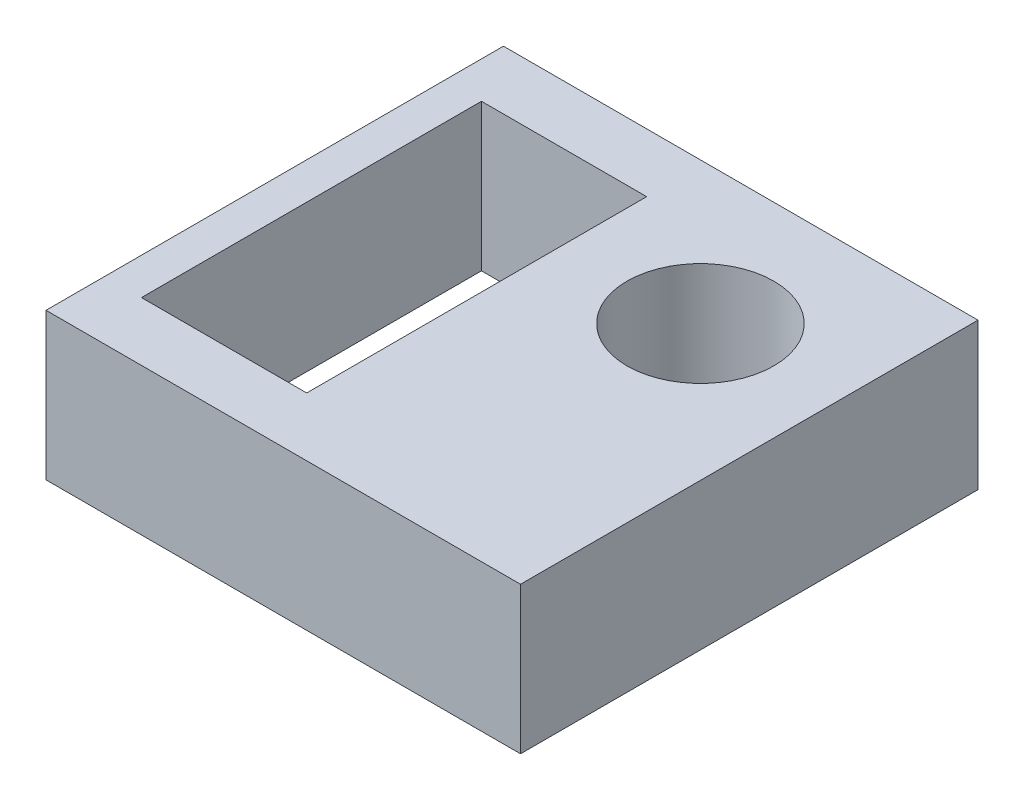
ISO-10303-21;
HEADER;
FILE_DESCRIPTION(('STEP AP214'),'2;1');
FILE_NAME('part.step','',(''),(''),'','','');
FILE_SCHEMA(('AUTOMOTIVE_DESIGN { 1 0 10303 214 1 1 1 1 }'));
ENDSEC;
DATA;
#1=APPLICATION_CONTEXT('core data for automotive mechanical design processes');
#2=APPLICATION_PROTOCOL_DEFINITION('international standard','automotive_design',2000,#1);
#3=PRODUCT_CONTEXT('',#1,'mechanical');
#4=PRODUCT('Part','Part','',(#3));
#5=PRODUCT_RELATED_PRODUCT_CATEGORY('part','',(#4));
#6=PRODUCT_DEFINITION_FORMATION('','',#4);
#7=PRODUCT_DEFINITION_CONTEXT('part definition',#1,'design');
#8=PRODUCT_DEFINITION('design','',#6,#7);
#9=PRODUCT_DEFINITION_SHAPE('','',#8);
#10=(LENGTH_UNIT() NAMED_UNIT(*) SI_UNIT(.MILLI.,.METRE.));
#11=(NAMED_UNIT(*) PLANE_ANGLE_UNIT() SI_UNIT($,.RADIAN.));
#12=(NAMED_UNIT(*) SI_UNIT($,.STERADIAN.) SOLID_ANGLE_UNIT());
#13=UNCERTAINTY_MEASURE_WITH_UNIT(LENGTH_MEASURE(1.E-05),#10,'distance_accuracy_value','');
#14=(GEOMETRIC_REPRESENTATION_CONTEXT(3) GLOBAL_UNCERTAINTY_ASSIGNED_CONTEXT((#13)) GLOBAL_UNIT_ASSIGNED_CONTEXT((#10,
#11,#12)) REPRESENTATION_CONTEXT('',''));
#15=CARTESIAN_POINT('',(0.,0.,0.));
#16=DIRECTION('',(0.,0.,1.));
#17=DIRECTION('',(1.,0.,0.));
#18=AXIS2_PLACEMENT_3D('',#15,#16,#17);
#19=CARTESIAN_POINT('',(0.,25.4,0.));
#20=DIRECTION('',(0.,1.,0.));
#21=DIRECTION('',(0.,0.,1.));
#22=AXIS2_PLACEMENT_3D('',#19,#20,#21);
#23=PLANE('',#22);
#24=DIRECTION('',(1.,0.,0.));
#25=VECTOR('',#24,1.);
#26=CARTESIAN_POINT('',(-75.7174,25.4,-10.16));
#27=LINE('',#26,#25);
#28=CARTESIAN_POINT('',(-75.7174,25.4,-10.16));
#29=VERTEX_POINT('',#28);
#30=CARTESIAN_POINT('',(-47.1424,25.4,-10.16));
#31=VERTEX_POINT('',#30);
#32=EDGE_CURVE('E106',#29,#31,#27,.T.);
#33=ORIENTED_EDGE('',*,*,#32,.F.);
#34=DIRECTION('',(0.,0.,1.));
#35=VECTOR('',#34,1.);
#36=CARTESIAN_POINT('',(-75.7174,25.4,-68.961));
#37=LINE('',#36,#35);
#38=CARTESIAN_POINT('',(-75.7174,25.4,-68.961));
#39=VERTEX_POINT('',#38);
#40=EDGE_CURVE('E98',#39,#29,#37,.T.);
#41=ORIENTED_EDGE('',*,*,#40,.F.);
#42=DIRECTION('',(-1.,0.,0.));
#43=VECTOR('',#42,1.);
#44=CARTESIAN_POINT('',(-75.7174,25.4,-68.961));
#45=LINE('',#44,#43);
#46=CARTESIAN_POINT('',(-47.1424,25.4,-68.961));
#47=VERTEX_POINT('',#46);
#48=EDGE_CURVE('E121',#47,#39,#45,.T.);
#49=ORIENTED_EDGE('',*,*,#48,.F.);
#50=DIRECTION('',(0.,0.,-1.));
#51=VECTOR('',#50,1.);
#52=CARTESIAN_POINT('',(-47.1424,25.4,-68.961));
#53=LINE('',#52,#51);
#54=EDGE_CURVE('E119',#31,#47,#53,.T.);
#55=ORIENTED_EDGE('',*,*,#54,.F.);
#56=EDGE_LOOP('',(#33,#41,#49,#55));
#57=FACE_BOUND('',#56,.T.);
#58=DIRECTION('',(0.,0.,-1.));
#59=VECTOR('',#58,1.);
#60=CARTESIAN_POINT('',(0.,25.4,0.));
#61=LINE('',#60,#59);
#62=CARTESIAN_POINT('',(0.,25.4,0.));
#63=VERTEX_POINT('',#62);
#64=CARTESIAN_POINT('',(0.,25.4,-79.121));
#65=VERTEX_POINT('',#64);
#66=EDGE_CURVE('E137',#63,#65,#61,.T.);
#67=ORIENTED_EDGE('',*,*,#66,.T.);
#68=DIRECTION('',(-1.,0.,0.));
#69=VECTOR('',#68,1.);
#70=CARTESIAN_POINT('',(0.,25.4,-79.121));
#71=LINE('',#70,#69);
#72=CARTESIAN_POINT('',(-82.0674,25.4,-79.121));
#73=VERTEX_POINT('',#72);
#74=EDGE_CURVE('E140',#65,#73,#71,.T.);
#75=ORIENTED_EDGE('',*,*,#74,.T.);
#76=DIRECTION('',(0.,0.,1.));
#77=VECTOR('',#76,1.);
#78=CARTESIAN_POINT('',(-82.0674,25.4,0.));
#79=LINE('',#78,#77);
#80=CARTESIAN_POINT('',(-82.0674,25.4,0.));
#81=VERTEX_POINT('',#80);
#82=EDGE_CURVE('E143',#73,#81,#79,.T.);
#83=ORIENTED_EDGE('',*,*,#82,.T.);
#84=DIRECTION('',(1.,0.,0.));
#85=VECTOR('',#84,1.);
#86=CARTESIAN_POINT('',(0.,25.4,0.));
#87=LINE('',#86,#85);
#88=EDGE_CURVE('E145',#81,#63,#87,.T.);
#89=ORIENTED_EDGE('',*,*,#88,.T.);
#90=EDGE_LOOP('',(#67,#75,#83,#89));
#91=FACE_BOUND('',#90,.T.);
#92=CARTESIAN_POINT('',(-23.495,25.4,-54.61));
#93=DIRECTION('',(0.,1.,0.));
#94=DIRECTION('',(0.,0.,1.));
#95=AXIS2_PLACEMENT_3D('',#92,#93,#94);
#96=CIRCLE('',#95,12.7);
#97=CARTESIAN_POINT('',(-23.495,25.4,-41.91));
#98=VERTEX_POINT('',#97);
#99=EDGE_CURVE('E127',#98,#98,#96,.T.);
#100=ORIENTED_EDGE('',*,*,#99,.F.);
#101=EDGE_LOOP('',(#100));
#102=FACE_BOUND('',#101,.T.);
#103=ADVANCED_FACE('F33',(#57,#91,#102),#23,.T.);
#104=CARTESIAN_POINT('',(0.,0.,0.));
#105=DIRECTION('',(0.,1.,0.));
#106=DIRECTION('',(0.,0.,1.));
#107=AXIS2_PLACEMENT_3D('',#104,#105,#106);
#108=PLANE('',#107);
#109=DIRECTION('',(0.,0.,1.));
#110=VECTOR('',#109,1.);
#111=CARTESIAN_POINT('',(-75.7174,0.,-68.961));
#112=LINE('',#111,#110);
#113=CARTESIAN_POINT('',(-75.7174,0.,-68.961));
#114=VERTEX_POINT('',#113);
#115=CARTESIAN_POINT('',(-75.7174,0.,-10.16));
#116=VERTEX_POINT('',#115);
#117=EDGE_CURVE('E56',#114,#116,#112,.T.);
#118=ORIENTED_EDGE('',*,*,#117,.T.);
#119=DIRECTION('',(1.,0.,0.));
#120=VECTOR('',#119,1.);
#121=CARTESIAN_POINT('',(-75.7174,0.,-10.16));
#122=LINE('',#121,#120);
#123=CARTESIAN_POINT('',(-47.1424,0.,-10.16));
#124=VERTEX_POINT('',#123);
#125=EDGE_CURVE('E113',#116,#124,#122,.T.);
#126=ORIENTED_EDGE('',*,*,#125,.T.);
#127=DIRECTION('',(0.,0.,-1.));
#128=VECTOR('',#127,1.);
#129=CARTESIAN_POINT('',(-47.1424,0.,-68.961));
#130=LINE('',#129,#128);
#131=CARTESIAN_POINT('',(-47.1424,0.,-68.961));
#132=VERTEX_POINT('',#131);
#133=EDGE_CURVE('E129',#124,#132,#130,.T.);
#134=ORIENTED_EDGE('',*,*,#133,.T.);
#135=DIRECTION('',(-1.,0.,0.));
#136=VECTOR('',#135,1.);
#137=CARTESIAN_POINT('',(-75.7174,0.,-68.961));
#138=LINE('',#137,#136);
#139=EDGE_CURVE('E107',#132,#114,#138,.T.);
#140=ORIENTED_EDGE('',*,*,#139,.T.);
#141=EDGE_LOOP('',(#118,#126,#134,#140));
#142=FACE_BOUND('',#141,.T.);
#143=DIRECTION('',(0.,0.,-1.));
#144=VECTOR('',#143,1.);
#145=CARTESIAN_POINT('',(0.,0.,0.));
#146=LINE('',#145,#144);
#147=CARTESIAN_POINT('',(0.,0.,0.));
#148=VERTEX_POINT('',#147);
#149=CARTESIAN_POINT('',(0.,0.,-79.121));
#150=VERTEX_POINT('',#149);
#151=EDGE_CURVE('E114',#148,#150,#146,.T.);
#152=ORIENTED_EDGE('',*,*,#151,.F.);
#153=DIRECTION('',(1.,0.,0.));
#154=VECTOR('',#153,1.);
#155=CARTESIAN_POINT('',(0.,0.,0.));
#156=LINE('',#155,#154);
#157=CARTESIAN_POINT('',(-82.0674,0.,0.));
#158=VERTEX_POINT('',#157);
#159=EDGE_CURVE('E141',#158,#148,#156,.T.);
#160=ORIENTED_EDGE('',*,*,#159,.F.);
#161=DIRECTION('',(0.,0.,1.));
#162=VECTOR('',#161,1.);
#163=CARTESIAN_POINT('',(-82.0674,0.,0.));
#164=LINE('',#163,#162);
#165=CARTESIAN_POINT('',(-82.0674,0.,-79.121));
#166=VERTEX_POINT('',#165);
#167=EDGE_CURVE('E152',#166,#158,#164,.T.);
#168=ORIENTED_EDGE('',*,*,#167,.F.);
#169=DIRECTION('',(-1.,0.,0.));
#170=VECTOR('',#169,1.);
#171=CARTESIAN_POINT('',(0.,0.,-79.121));
#172=LINE('',#171,#170);
#173=EDGE_CURVE('E150',#150,#166,#172,.T.);
#174=ORIENTED_EDGE('',*,*,#173,.F.);
#175=EDGE_LOOP('',(#152,#160,#168,#174));
#176=FACE_BOUND('',#175,.T.);
#177=CARTESIAN_POINT('',(-23.495,0.,-54.61));
#178=DIRECTION('',(0.,1.,0.));
#179=DIRECTION('',(0.,0.,1.));
#180=AXIS2_PLACEMENT_3D('',#177,#178,#179);
#181=CIRCLE('',#180,12.7);
#182=CARTESIAN_POINT('',(-23.495,0.,-41.91));
#183=VERTEX_POINT('',#182);
#184=EDGE_CURVE('E224',#183,#183,#181,.T.);
#185=ORIENTED_EDGE('',*,*,#184,.T.);
#186=EDGE_LOOP('',(#185));
#187=FACE_BOUND('',#186,.T.);
#188=ADVANCED_FACE('F170',(#142,#176,#187),#108,.F.);
#189=CARTESIAN_POINT('',(0.,25.4,0.));
#190=DIRECTION('',(-1.,0.,0.));
#191=DIRECTION('',(0.,0.,1.));
#192=AXIS2_PLACEMENT_3D('',#189,#190,#191);
#193=PLANE('',#192);
#194=ORIENTED_EDGE('',*,*,#151,.T.);
#195=DIRECTION('',(0.,-1.,0.));
#196=VECTOR('',#195,1.);
#197=CARTESIAN_POINT('',(0.,25.4,-79.121));
#198=LINE('',#197,#196);
#199=EDGE_CURVE('E11',#65,#150,#198,.T.);
#200=ORIENTED_EDGE('',*,*,#199,.F.);
#201=ORIENTED_EDGE('',*,*,#66,.F.);
#202=DIRECTION('',(0.,-1.,0.));
#203=VECTOR('',#202,1.);
#204=CARTESIAN_POINT('',(0.,25.4,0.));
#205=LINE('',#204,#203);
#206=EDGE_CURVE('E147',#63,#148,#205,.T.);
#207=ORIENTED_EDGE('',*,*,#206,.T.);
#208=EDGE_LOOP('',(#194,#200,#201,#207));
#209=FACE_BOUND('',#208,.T.);
#210=ADVANCED_FACE('F35',(#209),#193,.F.);
#211=CARTESIAN_POINT('',(0.,25.4,-79.121));
#212=DIRECTION('',(0.,0.,1.));
#213=DIRECTION('',(1.,0.,0.));
#214=AXIS2_PLACEMENT_3D('',#211,#212,#213);
#215=PLANE('',#214);
#216=ORIENTED_EDGE('',*,*,#173,.T.);
#217=DIRECTION('',(0.,-1.,0.));
#218=VECTOR('',#217,1.);
#219=CARTESIAN_POINT('',(-82.0674,25.4,-79.121));
#220=LINE('',#219,#218);
#221=EDGE_CURVE('E41',#73,#166,#220,.T.);
#222=ORIENTED_EDGE('',*,*,#221,.F.);
#223=ORIENTED_EDGE('',*,*,#74,.F.);
#224=ORIENTED_EDGE('',*,*,#199,.T.);
#225=EDGE_LOOP('',(#216,#222,#223,#224));
#226=FACE_BOUND('',#225,.T.);
#227=ADVANCED_FACE('F180',(#226),#215,.F.);
#228=CARTESIAN_POINT('',(-82.0674,25.4,0.));
#229=DIRECTION('',(1.,0.,0.));
#230=DIRECTION('',(0.,0.,-1.));
#231=AXIS2_PLACEMENT_3D('',#228,#229,#230);
#232=PLANE('',#231);
#233=ORIENTED_EDGE('',*,*,#167,.T.);
#234=DIRECTION('',(0.,-1.,0.));
#235=VECTOR('',#234,1.);
#236=CARTESIAN_POINT('',(-82.0674,25.4,0.));
#237=LINE('',#236,#235);
#238=EDGE_CURVE('E157',#81,#158,#237,.T.);
#239=ORIENTED_EDGE('',*,*,#238,.F.);
#240=ORIENTED_EDGE('',*,*,#82,.F.);
#241=ORIENTED_EDGE('',*,*,#221,.T.);
#242=EDGE_LOOP('',(#233,#239,#240,#241));
#243=FACE_BOUND('',#242,.T.);
#244=ADVANCED_FACE('F164',(#243),#232,.F.);
#245=CARTESIAN_POINT('',(0.,25.4,0.));
#246=DIRECTION('',(0.,0.,-1.));
#247=DIRECTION('',(-1.,0.,0.));
#248=AXIS2_PLACEMENT_3D('',#245,#246,#247);
#249=PLANE('',#248);
#250=ORIENTED_EDGE('',*,*,#159,.T.);
#251=ORIENTED_EDGE('',*,*,#206,.F.);
#252=ORIENTED_EDGE('',*,*,#88,.F.);
#253=ORIENTED_EDGE('',*,*,#238,.T.);
#254=EDGE_LOOP('',(#250,#251,#252,#253));
#255=FACE_BOUND('',#254,.T.);
#256=ADVANCED_FACE('F174',(#255),#249,.F.);
#257=CARTESIAN_POINT('',(-75.7174,25.4,-68.961));
#258=DIRECTION('',(1.,0.,0.));
#259=DIRECTION('',(0.,0.,-1.));
#260=AXIS2_PLACEMENT_3D('',#257,#258,#259);
#261=PLANE('',#260);
#262=ORIENTED_EDGE('',*,*,#117,.F.);
#263=DIRECTION('',(0.,-1.,0.));
#264=VECTOR('',#263,1.);
#265=CARTESIAN_POINT('',(-75.7174,25.4,-68.961));
#266=LINE('',#265,#264);
#267=EDGE_CURVE('E102',#39,#114,#266,.T.);
#268=ORIENTED_EDGE('',*,*,#267,.F.);
#269=ORIENTED_EDGE('',*,*,#40,.T.);
#270=DIRECTION('',(0.,-1.,0.));
#271=VECTOR('',#270,1.);
#272=CARTESIAN_POINT('',(-75.7174,25.4,-10.16));
#273=LINE('',#272,#271);
#274=EDGE_CURVE('E101',#29,#116,#273,.T.);
#275=ORIENTED_EDGE('',*,*,#274,.T.);
#276=EDGE_LOOP('',(#262,#268,#269,#275));
#277=FACE_BOUND('',#276,.T.);
#278=ADVANCED_FACE('F100',(#277),#261,.T.);
#279=CARTESIAN_POINT('',(-75.7174,25.4,-10.16));
#280=DIRECTION('',(0.,0.,-1.));
#281=DIRECTION('',(-1.,0.,0.));
#282=AXIS2_PLACEMENT_3D('',#279,#280,#281);
#283=PLANE('',#282);
#284=ORIENTED_EDGE('',*,*,#125,.F.);
#285=ORIENTED_EDGE('',*,*,#274,.F.);
#286=ORIENTED_EDGE('',*,*,#32,.T.);
#287=DIRECTION('',(0.,-1.,0.));
#288=VECTOR('',#287,1.);
#289=CARTESIAN_POINT('',(-47.1424,25.4,-10.16));
#290=LINE('',#289,#288);
#291=EDGE_CURVE('E115',#31,#124,#290,.T.);
#292=ORIENTED_EDGE('',*,*,#291,.T.);
#293=EDGE_LOOP('',(#284,#285,#286,#292));
#294=FACE_BOUND('',#293,.T.);
#295=ADVANCED_FACE('F110',(#294),#283,.T.);
#296=CARTESIAN_POINT('',(-47.1424,25.4,-68.961));
#297=DIRECTION('',(-1.,0.,0.));
#298=DIRECTION('',(0.,0.,1.));
#299=AXIS2_PLACEMENT_3D('',#296,#297,#298);
#300=PLANE('',#299);
#301=ORIENTED_EDGE('',*,*,#133,.F.);
#302=ORIENTED_EDGE('',*,*,#291,.F.);
#303=ORIENTED_EDGE('',*,*,#54,.T.);
#304=DIRECTION('',(0.,-1.,0.));
#305=VECTOR('',#304,1.);
#306=CARTESIAN_POINT('',(-47.1424,25.4,-68.961));
#307=LINE('',#306,#305);
#308=EDGE_CURVE('E48',#47,#132,#307,.T.);
#309=ORIENTED_EDGE('',*,*,#308,.T.);
#310=EDGE_LOOP('',(#301,#302,#303,#309));
#311=FACE_BOUND('',#310,.T.);
#312=ADVANCED_FACE('F204',(#311),#300,.T.);
#313=CARTESIAN_POINT('',(-75.7174,25.4,-68.961));
#314=DIRECTION('',(0.,0.,1.));
#315=DIRECTION('',(1.,0.,0.));
#316=AXIS2_PLACEMENT_3D('',#313,#314,#315);
#317=PLANE('',#316);
#318=ORIENTED_EDGE('',*,*,#139,.F.);
#319=ORIENTED_EDGE('',*,*,#308,.F.);
#320=ORIENTED_EDGE('',*,*,#48,.T.);
#321=ORIENTED_EDGE('',*,*,#267,.T.);
#322=EDGE_LOOP('',(#318,#319,#320,#321));
#323=FACE_BOUND('',#322,.T.);
#324=ADVANCED_FACE('F208',(#323),#317,.T.);
#325=CARTESIAN_POINT('',(-23.495,25.4,-54.61));
#326=DIRECTION('',(0.,-1.,0.));
#327=DIRECTION('',(0.,0.,-1.));
#328=AXIS2_PLACEMENT_3D('',#325,#326,#327);
#329=CYLINDRICAL_SURFACE('',#328,12.7);
#330=ORIENTED_EDGE('',*,*,#99,.T.);
#331=EDGE_LOOP('',(#330));
#332=FACE_BOUND('',#331,.T.);
#333=ORIENTED_EDGE('',*,*,#184,.F.);
#334=EDGE_LOOP('',(#333));
#335=FACE_BOUND('',#334,.T.);
#336=ADVANCED_FACE('F214',(#332,#335),#329,.F.);
#337=CLOSED_SHELL('',(#103,#188,#210,#227,#244,#256,#278,#295,#312,#324,#336));
#338=MANIFOLD_SOLID_BREP('B2',#337);
#339=ADVANCED_BREP_SHAPE_REPRESENTATION('',(#18,#338),#14);
#340=SHAPE_DEFINITION_REPRESENTATION(#9,#339);
ENDSEC;
END-ISO-10303-21;
